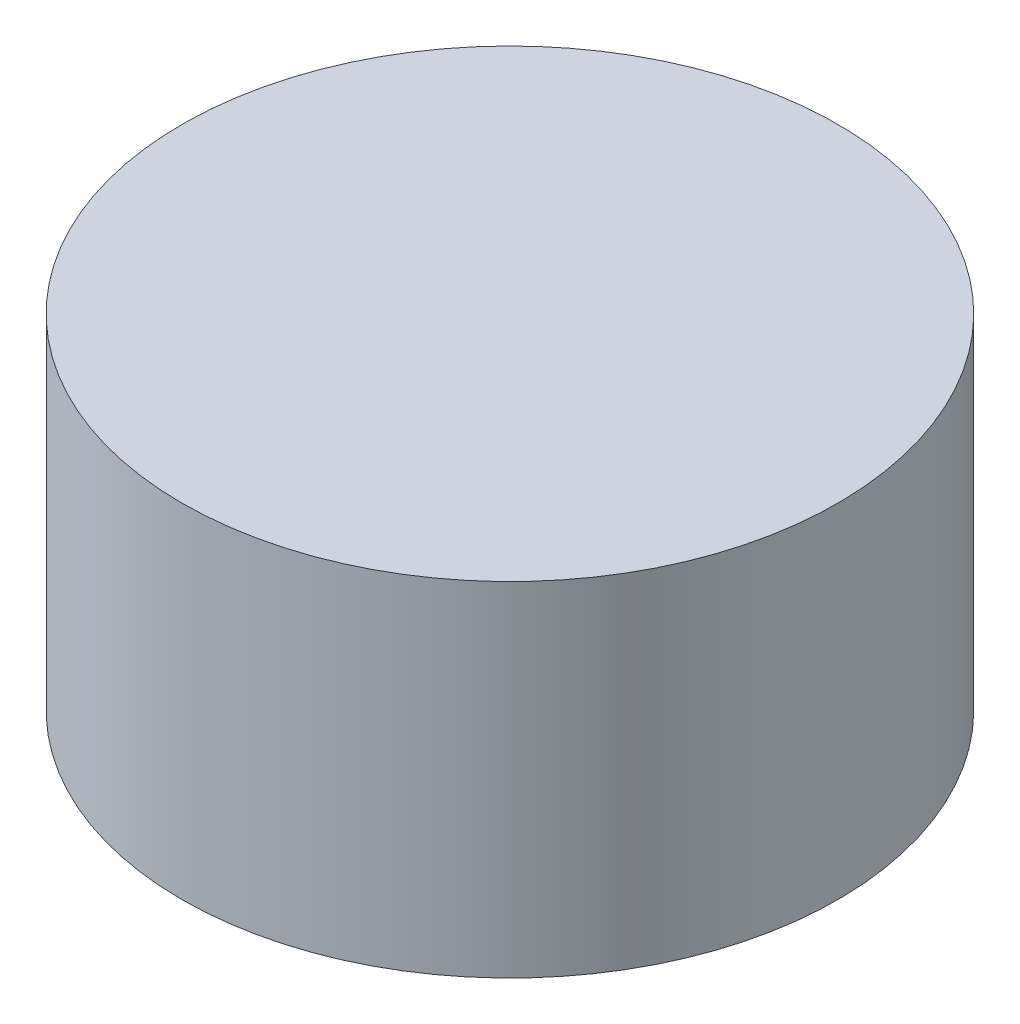
ISO-10303-21;
HEADER;
FILE_DESCRIPTION(('STEP AP214'),'2;1');
FILE_NAME('part.step','',(''),(''),'','','');
FILE_SCHEMA(('AUTOMOTIVE_DESIGN { 1 0 10303 214 1 1 1 1 }'));
ENDSEC;
DATA;
#1=APPLICATION_CONTEXT('core data for automotive mechanical design processes');
#2=APPLICATION_PROTOCOL_DEFINITION('international standard','automotive_design',2000,#1);
#3=PRODUCT_CONTEXT('',#1,'mechanical');
#4=PRODUCT('Part','Part','',(#3));
#5=PRODUCT_RELATED_PRODUCT_CATEGORY('part','',(#4));
#6=PRODUCT_DEFINITION_FORMATION('','',#4);
#7=PRODUCT_DEFINITION_CONTEXT('part definition',#1,'design');
#8=PRODUCT_DEFINITION('design','',#6,#7);
#9=PRODUCT_DEFINITION_SHAPE('','',#8);
#10=(LENGTH_UNIT() NAMED_UNIT(*) SI_UNIT(.MILLI.,.METRE.));
#11=(NAMED_UNIT(*) PLANE_ANGLE_UNIT() SI_UNIT($,.RADIAN.));
#12=(NAMED_UNIT(*) SI_UNIT($,.STERADIAN.) SOLID_ANGLE_UNIT());
#13=UNCERTAINTY_MEASURE_WITH_UNIT(LENGTH_MEASURE(1.E-05),#10,'distance_accuracy_value','');
#14=(GEOMETRIC_REPRESENTATION_CONTEXT(3) GLOBAL_UNCERTAINTY_ASSIGNED_CONTEXT((#13)) GLOBAL_UNIT_ASSIGNED_CONTEXT((#10,
#11,#12)) REPRESENTATION_CONTEXT('',''));
#15=CARTESIAN_POINT('',(0.,0.,0.));
#16=DIRECTION('',(0.,0.,1.));
#17=DIRECTION('',(1.,0.,0.));
#18=AXIS2_PLACEMENT_3D('',#15,#16,#17);
#19=CARTESIAN_POINT('',(0.,25.4,0.));
#20=DIRECTION('',(0.,-1.,0.));
#21=DIRECTION('',(0.,0.,-1.));
#22=AXIS2_PLACEMENT_3D('',#19,#20,#21);
#23=CYLINDRICAL_SURFACE('',#22,24.2594412362313);
#24=CARTESIAN_POINT('',(0.,25.4,0.));
#25=DIRECTION('',(0.,1.,0.));
#26=DIRECTION('',(0.,0.,1.));
#27=AXIS2_PLACEMENT_3D('',#24,#25,#26);
#28=CIRCLE('',#27,24.2594412362313);
#29=CARTESIAN_POINT('',(0.,25.4,24.2594412362313));
#30=VERTEX_POINT('',#29);
#31=EDGE_CURVE('E10',#30,#30,#28,.T.);
#32=ORIENTED_EDGE('',*,*,#31,.F.);
#33=EDGE_LOOP('',(#32));
#34=FACE_BOUND('',#33,.T.);
#35=CARTESIAN_POINT('',(0.,0.,0.));
#36=DIRECTION('',(0.,1.,0.));
#37=DIRECTION('',(0.,0.,1.));
#38=AXIS2_PLACEMENT_3D('',#35,#36,#37);
#39=CIRCLE('',#38,24.2594412362313);
#40=CARTESIAN_POINT('',(0.,0.,24.2594412362313));
#41=VERTEX_POINT('',#40);
#42=EDGE_CURVE('E37',#41,#41,#39,.T.);
#43=ORIENTED_EDGE('',*,*,#42,.T.);
#44=EDGE_LOOP('',(#43));
#45=FACE_BOUND('',#44,.T.);
#46=ADVANCED_FACE('F34',(#34,#45),#23,.T.);
#47=CARTESIAN_POINT('',(0.,25.4,0.));
#48=DIRECTION('',(0.,1.,0.));
#49=DIRECTION('',(0.,0.,1.));
#50=AXIS2_PLACEMENT_3D('',#47,#48,#49);
#51=PLANE('',#50);
#52=ORIENTED_EDGE('',*,*,#31,.T.);
#53=EDGE_LOOP('',(#52));
#54=FACE_BOUND('',#53,.T.);
#55=ADVANCED_FACE('F49',(#54),#51,.T.);
#56=CARTESIAN_POINT('',(0.,0.,0.));
#57=DIRECTION('',(0.,1.,0.));
#58=DIRECTION('',(0.,0.,1.));
#59=AXIS2_PLACEMENT_3D('',#56,#57,#58);
#60=PLANE('',#59);
#61=ORIENTED_EDGE('',*,*,#42,.F.);
#62=EDGE_LOOP('',(#61));
#63=FACE_BOUND('',#62,.T.);
#64=ADVANCED_FACE('F47',(#63),#60,.F.);
#65=CLOSED_SHELL('',(#46,#55,#64));
#66=MANIFOLD_SOLID_BREP('B2',#65);
#67=ADVANCED_BREP_SHAPE_REPRESENTATION('',(#18,#66),#14);
#68=SHAPE_DEFINITION_REPRESENTATION(#9,#67);
ENDSEC;
END-ISO-10303-21;
